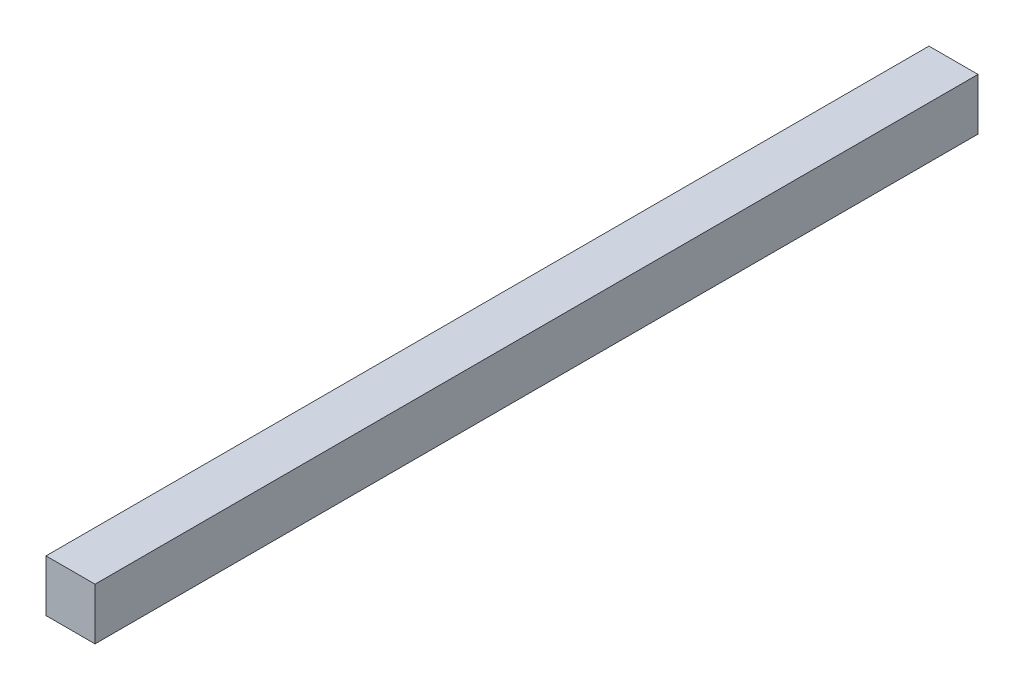
ISO-10303-21;
HEADER;
FILE_DESCRIPTION(('STEP AP214'),'2;1');
FILE_NAME('part.step','',(''),(''),'','','');
FILE_SCHEMA(('AUTOMOTIVE_DESIGN { 1 0 10303 214 1 1 1 1 }'));
ENDSEC;
DATA;
#1=APPLICATION_CONTEXT('core data for automotive mechanical design processes');
#2=APPLICATION_PROTOCOL_DEFINITION('international standard','automotive_design',2000,#1);
#3=PRODUCT_CONTEXT('',#1,'mechanical');
#4=PRODUCT('Part','Part','',(#3));
#5=PRODUCT_RELATED_PRODUCT_CATEGORY('part','',(#4));
#6=PRODUCT_DEFINITION_FORMATION('','',#4);
#7=PRODUCT_DEFINITION_CONTEXT('part definition',#1,'design');
#8=PRODUCT_DEFINITION('design','',#6,#7);
#9=PRODUCT_DEFINITION_SHAPE('','',#8);
#10=(LENGTH_UNIT() NAMED_UNIT(*) SI_UNIT(.MILLI.,.METRE.));
#11=(NAMED_UNIT(*) PLANE_ANGLE_UNIT() SI_UNIT($,.RADIAN.));
#12=(NAMED_UNIT(*) SI_UNIT($,.STERADIAN.) SOLID_ANGLE_UNIT());
#13=UNCERTAINTY_MEASURE_WITH_UNIT(LENGTH_MEASURE(1.E-05),#10,'distance_accuracy_value','');
#14=(GEOMETRIC_REPRESENTATION_CONTEXT(3) GLOBAL_UNCERTAINTY_ASSIGNED_CONTEXT((#13)) GLOBAL_UNIT_ASSIGNED_CONTEXT((#10,
#11,#12)) REPRESENTATION_CONTEXT('',''));
#15=CARTESIAN_POINT('',(0.,0.,0.));
#16=DIRECTION('',(0.,0.,1.));
#17=DIRECTION('',(1.,0.,0.));
#18=AXIS2_PLACEMENT_3D('',#15,#16,#17);
#19=CARTESIAN_POINT('',(4.83268449994512,-5.0999457849845,-74.1));
#20=DIRECTION('',(1.,0.,0.));
#21=DIRECTION('',(0.,0.,-1.));
#22=AXIS2_PLACEMENT_3D('',#19,#20,#21);
#23=PLANE('',#22);
#24=DIRECTION('',(0.,0.,1.));
#25=VECTOR('',#24,1.);
#26=CARTESIAN_POINT('',(4.83268449994512,5.0999457849845,-74.1));
#27=LINE('',#26,#25);
#28=CARTESIAN_POINT('',(4.83268449994512,5.0999457849845,-74.1));
#29=VERTEX_POINT('',#28);
#30=CARTESIAN_POINT('',(4.83268449994512,5.0999457849845,100.));
#31=VERTEX_POINT('',#30);
#32=EDGE_CURVE('E44',#29,#31,#27,.T.);
#33=ORIENTED_EDGE('',*,*,#32,.T.);
#34=DIRECTION('',(0.,1.,0.));
#35=VECTOR('',#34,1.);
#36=CARTESIAN_POINT('',(4.83268449994512,-5.0999457849845,100.));
#37=LINE('',#36,#35);
#38=CARTESIAN_POINT('',(4.83268449994512,-5.0999457849845,100.));
#39=VERTEX_POINT('',#38);
#40=EDGE_CURVE('E81',#39,#31,#37,.T.);
#41=ORIENTED_EDGE('',*,*,#40,.F.);
#42=DIRECTION('',(0.,0.,1.));
#43=VECTOR('',#42,1.);
#44=CARTESIAN_POINT('',(4.83268449994512,-5.0999457849845,-74.1));
#45=LINE('',#44,#43);
#46=CARTESIAN_POINT('',(4.83268449994512,-5.0999457849845,-74.1));
#47=VERTEX_POINT('',#46);
#48=EDGE_CURVE('E11',#47,#39,#45,.T.);
#49=ORIENTED_EDGE('',*,*,#48,.F.);
#50=DIRECTION('',(0.,1.,0.));
#51=VECTOR('',#50,1.);
#52=CARTESIAN_POINT('',(4.83268449994512,-5.0999457849845,-74.1));
#53=LINE('',#52,#51);
#54=EDGE_CURVE('E82',#47,#29,#53,.T.);
#55=ORIENTED_EDGE('',*,*,#54,.T.);
#56=EDGE_LOOP('',(#33,#41,#49,#55));
#57=FACE_BOUND('',#56,.T.);
#58=ADVANCED_FACE('F41',(#57),#23,.T.);
#59=CARTESIAN_POINT('',(-4.83268449994512,-5.0999457849845,-74.1));
#60=DIRECTION('',(0.,-1.,0.));
#61=DIRECTION('',(0.,0.,-1.));
#62=AXIS2_PLACEMENT_3D('',#59,#60,#61);
#63=PLANE('',#62);
#64=ORIENTED_EDGE('',*,*,#48,.T.);
#65=DIRECTION('',(1.,0.,0.));
#66=VECTOR('',#65,1.);
#67=CARTESIAN_POINT('',(-4.83268449994512,-5.0999457849845,100.));
#68=LINE('',#67,#66);
#69=CARTESIAN_POINT('',(-4.83268449994512,-5.0999457849845,100.));
#70=VERTEX_POINT('',#69);
#71=EDGE_CURVE('E98',#70,#39,#68,.T.);
#72=ORIENTED_EDGE('',*,*,#71,.F.);
#73=DIRECTION('',(0.,0.,1.));
#74=VECTOR('',#73,1.);
#75=CARTESIAN_POINT('',(-4.83268449994512,-5.0999457849845,-74.1));
#76=LINE('',#75,#74);
#77=CARTESIAN_POINT('',(-4.83268449994512,-5.0999457849845,-74.1));
#78=VERTEX_POINT('',#77);
#79=EDGE_CURVE('E49',#78,#70,#76,.T.);
#80=ORIENTED_EDGE('',*,*,#79,.F.);
#81=DIRECTION('',(1.,0.,0.));
#82=VECTOR('',#81,1.);
#83=CARTESIAN_POINT('',(-4.83268449994512,-5.0999457849845,-74.1));
#84=LINE('',#83,#82);
#85=EDGE_CURVE('E87',#78,#47,#84,.T.);
#86=ORIENTED_EDGE('',*,*,#85,.T.);
#87=EDGE_LOOP('',(#64,#72,#80,#86));
#88=FACE_BOUND('',#87,.T.);
#89=ADVANCED_FACE('F113',(#88),#63,.T.);
#90=CARTESIAN_POINT('',(-4.83268449994512,-5.0999457849845,-74.1));
#91=DIRECTION('',(-1.,0.,0.));
#92=DIRECTION('',(0.,0.,1.));
#93=AXIS2_PLACEMENT_3D('',#90,#91,#92);
#94=PLANE('',#93);
#95=ORIENTED_EDGE('',*,*,#79,.T.);
#96=DIRECTION('',(0.,-1.,0.));
#97=VECTOR('',#96,1.);
#98=CARTESIAN_POINT('',(-4.83268449994512,-5.0999457849845,100.));
#99=LINE('',#98,#97);
#100=CARTESIAN_POINT('',(-4.83268449994512,5.0999457849845,100.));
#101=VERTEX_POINT('',#100);
#102=EDGE_CURVE('E94',#101,#70,#99,.T.);
#103=ORIENTED_EDGE('',*,*,#102,.F.);
#104=DIRECTION('',(0.,0.,1.));
#105=VECTOR('',#104,1.);
#106=CARTESIAN_POINT('',(-4.83268449994512,5.0999457849845,-74.1));
#107=LINE('',#106,#105);
#108=CARTESIAN_POINT('',(-4.83268449994512,5.0999457849845,-74.1));
#109=VERTEX_POINT('',#108);
#110=EDGE_CURVE('E86',#109,#101,#107,.T.);
#111=ORIENTED_EDGE('',*,*,#110,.F.);
#112=DIRECTION('',(0.,-1.,0.));
#113=VECTOR('',#112,1.);
#114=CARTESIAN_POINT('',(-4.83268449994512,-5.0999457849845,-74.1));
#115=LINE('',#114,#113);
#116=EDGE_CURVE('E106',#109,#78,#115,.T.);
#117=ORIENTED_EDGE('',*,*,#116,.T.);
#118=EDGE_LOOP('',(#95,#103,#111,#117));
#119=FACE_BOUND('',#118,.T.);
#120=ADVANCED_FACE('F110',(#119),#94,.T.);
#121=CARTESIAN_POINT('',(-4.83268449994512,5.0999457849845,-74.1));
#122=DIRECTION('',(0.,1.,0.));
#123=DIRECTION('',(0.,0.,1.));
#124=AXIS2_PLACEMENT_3D('',#121,#122,#123);
#125=PLANE('',#124);
#126=ORIENTED_EDGE('',*,*,#110,.T.);
#127=DIRECTION('',(-1.,0.,0.));
#128=VECTOR('',#127,1.);
#129=CARTESIAN_POINT('',(-4.83268449994512,5.0999457849845,100.));
#130=LINE('',#129,#128);
#131=EDGE_CURVE('E89',#31,#101,#130,.T.);
#132=ORIENTED_EDGE('',*,*,#131,.F.);
#133=ORIENTED_EDGE('',*,*,#32,.F.);
#134=DIRECTION('',(-1.,0.,0.));
#135=VECTOR('',#134,1.);
#136=CARTESIAN_POINT('',(-4.83268449994512,5.0999457849845,-74.1));
#137=LINE('',#136,#135);
#138=EDGE_CURVE('E104',#29,#109,#137,.T.);
#139=ORIENTED_EDGE('',*,*,#138,.T.);
#140=EDGE_LOOP('',(#126,#132,#133,#139));
#141=FACE_BOUND('',#140,.T.);
#142=ADVANCED_FACE('F90',(#141),#125,.T.);
#143=CARTESIAN_POINT('',(0.,0.,-74.1));
#144=DIRECTION('',(0.,0.,-1.));
#145=DIRECTION('',(-1.,0.,0.));
#146=AXIS2_PLACEMENT_3D('',#143,#144,#145);
#147=PLANE('',#146);
#148=ORIENTED_EDGE('',*,*,#54,.F.);
#149=ORIENTED_EDGE('',*,*,#85,.F.);
#150=ORIENTED_EDGE('',*,*,#116,.F.);
#151=ORIENTED_EDGE('',*,*,#138,.F.);
#152=EDGE_LOOP('',(#148,#149,#150,#151));
#153=FACE_BOUND('',#152,.T.);
#154=ADVANCED_FACE('F115',(#153),#147,.T.);
#155=CARTESIAN_POINT('',(0.,0.,100.));
#156=DIRECTION('',(0.,0.,-1.));
#157=DIRECTION('',(-1.,0.,0.));
#158=AXIS2_PLACEMENT_3D('',#155,#156,#157);
#159=PLANE('',#158);
#160=ORIENTED_EDGE('',*,*,#40,.T.);
#161=ORIENTED_EDGE('',*,*,#131,.T.);
#162=ORIENTED_EDGE('',*,*,#102,.T.);
#163=ORIENTED_EDGE('',*,*,#71,.T.);
#164=EDGE_LOOP('',(#160,#161,#162,#163));
#165=FACE_BOUND('',#164,.T.);
#166=ADVANCED_FACE('F97',(#165),#159,.F.);
#167=CLOSED_SHELL('',(#58,#89,#120,#142,#154,#166));
#168=MANIFOLD_SOLID_BREP('B2',#167);
#169=ADVANCED_BREP_SHAPE_REPRESENTATION('',(#18,#168),#14);
#170=SHAPE_DEFINITION_REPRESENTATION(#9,#169);
ENDSEC;
END-ISO-10303-21;
